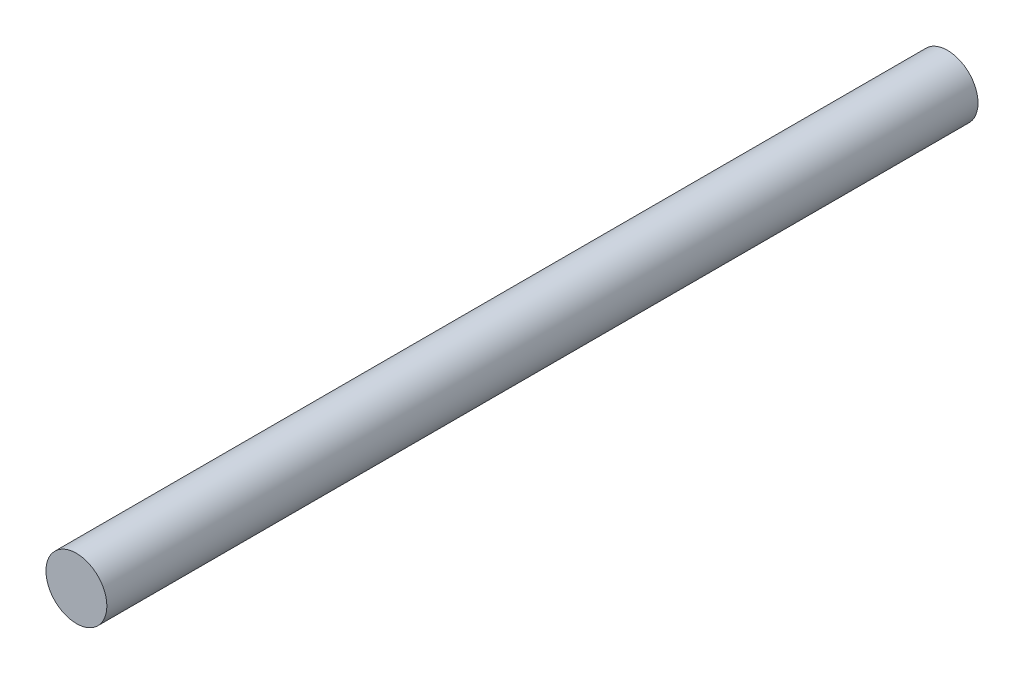
ISO-10303-21;
HEADER;
FILE_DESCRIPTION(('STEP AP214'),'2;1');
FILE_NAME('part.step','',(''),(''),'','','');
FILE_SCHEMA(('AUTOMOTIVE_DESIGN { 1 0 10303 214 1 1 1 1 }'));
ENDSEC;
DATA;
#1=APPLICATION_CONTEXT('core data for automotive mechanical design processes');
#2=APPLICATION_PROTOCOL_DEFINITION('international standard','automotive_design',2000,#1);
#3=PRODUCT_CONTEXT('',#1,'mechanical');
#4=PRODUCT('Part','Part','',(#3));
#5=PRODUCT_RELATED_PRODUCT_CATEGORY('part','',(#4));
#6=PRODUCT_DEFINITION_FORMATION('','',#4);
#7=PRODUCT_DEFINITION_CONTEXT('part definition',#1,'design');
#8=PRODUCT_DEFINITION('design','',#6,#7);
#9=PRODUCT_DEFINITION_SHAPE('','',#8);
#10=(LENGTH_UNIT() NAMED_UNIT(*) SI_UNIT(.MILLI.,.METRE.));
#11=(NAMED_UNIT(*) PLANE_ANGLE_UNIT() SI_UNIT($,.RADIAN.));
#12=(NAMED_UNIT(*) SI_UNIT($,.STERADIAN.) SOLID_ANGLE_UNIT());
#13=UNCERTAINTY_MEASURE_WITH_UNIT(LENGTH_MEASURE(1.E-05),#10,'distance_accuracy_value','');
#14=(GEOMETRIC_REPRESENTATION_CONTEXT(3) GLOBAL_UNCERTAINTY_ASSIGNED_CONTEXT((#13)) GLOBAL_UNIT_ASSIGNED_CONTEXT((#10,
#11,#12)) REPRESENTATION_CONTEXT('',''));
#15=CARTESIAN_POINT('',(0.,0.,0.));
#16=DIRECTION('',(0.,0.,1.));
#17=DIRECTION('',(1.,0.,0.));
#18=AXIS2_PLACEMENT_3D('',#15,#16,#17);
#19=CARTESIAN_POINT('',(0.,0.,114.4));
#20=DIRECTION('',(0.,0.,-1.));
#21=DIRECTION('',(-1.,0.,0.));
#22=AXIS2_PLACEMENT_3D('',#19,#20,#21);
#23=CYLINDRICAL_SURFACE('',#22,4.);
#24=CARTESIAN_POINT('',(0.,0.,114.4));
#25=DIRECTION('',(0.,0.,1.));
#26=DIRECTION('',(1.,0.,0.));
#27=AXIS2_PLACEMENT_3D('',#24,#25,#26);
#28=CIRCLE('',#27,4.);
#29=CARTESIAN_POINT('',(4.,0.,114.4));
#30=VERTEX_POINT('',#29);
#31=EDGE_CURVE('E10',#30,#30,#28,.T.);
#32=ORIENTED_EDGE('',*,*,#31,.F.);
#33=EDGE_LOOP('',(#32));
#34=FACE_BOUND('',#33,.T.);
#35=CARTESIAN_POINT('',(0.,0.,0.));
#36=DIRECTION('',(0.,0.,1.));
#37=DIRECTION('',(1.,0.,0.));
#38=AXIS2_PLACEMENT_3D('',#35,#36,#37);
#39=CIRCLE('',#38,4.);
#40=CARTESIAN_POINT('',(4.,0.,0.));
#41=VERTEX_POINT('',#40);
#42=EDGE_CURVE('E38',#41,#41,#39,.T.);
#43=ORIENTED_EDGE('',*,*,#42,.T.);
#44=EDGE_LOOP('',(#43));
#45=FACE_BOUND('',#44,.T.);
#46=ADVANCED_FACE('F35',(#34,#45),#23,.T.);
#47=CARTESIAN_POINT('',(0.,0.,114.4));
#48=DIRECTION('',(0.,0.,1.));
#49=DIRECTION('',(1.,0.,0.));
#50=AXIS2_PLACEMENT_3D('',#47,#48,#49);
#51=PLANE('',#50);
#52=ORIENTED_EDGE('',*,*,#31,.T.);
#53=EDGE_LOOP('',(#52));
#54=FACE_BOUND('',#53,.T.);
#55=ADVANCED_FACE('F50',(#54),#51,.T.);
#56=CARTESIAN_POINT('',(0.,0.,0.));
#57=DIRECTION('',(0.,0.,1.));
#58=DIRECTION('',(1.,0.,0.));
#59=AXIS2_PLACEMENT_3D('',#56,#57,#58);
#60=PLANE('',#59);
#61=ORIENTED_EDGE('',*,*,#42,.F.);
#62=EDGE_LOOP('',(#61));
#63=FACE_BOUND('',#62,.T.);
#64=ADVANCED_FACE('F48',(#63),#60,.F.);
#65=CLOSED_SHELL('',(#46,#55,#64));
#66=MANIFOLD_SOLID_BREP('B2',#65);
#67=ADVANCED_BREP_SHAPE_REPRESENTATION('',(#18,#66),#14);
#68=SHAPE_DEFINITION_REPRESENTATION(#9,#67);
ENDSEC;
END-ISO-10303-21;
